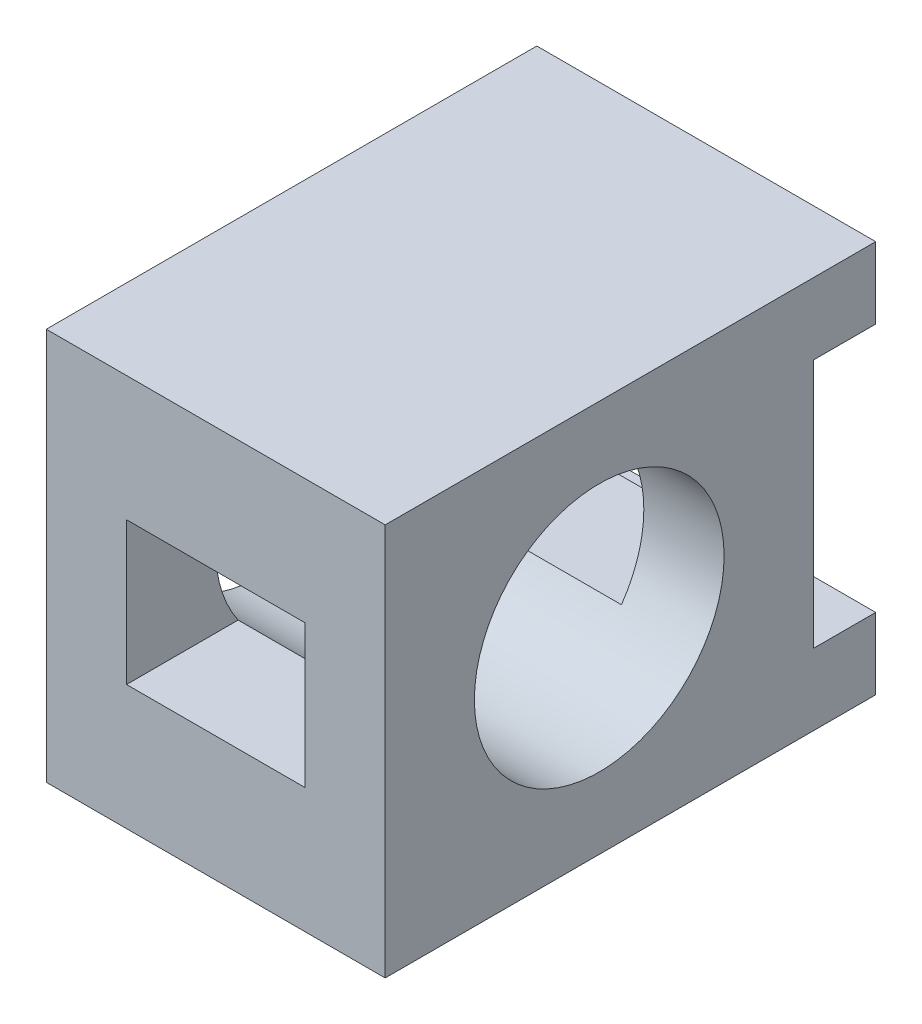
ISO-10303-21;
HEADER;
FILE_DESCRIPTION(('STEP AP214'),'2;1');
FILE_NAME('part.step','',(''),(''),'','','');
FILE_SCHEMA(('AUTOMOTIVE_DESIGN { 1 0 10303 214 1 1 1 1 }'));
ENDSEC;
DATA;
#1=APPLICATION_CONTEXT('core data for automotive mechanical design processes');
#2=APPLICATION_PROTOCOL_DEFINITION('international standard','automotive_design',2000,#1);
#3=PRODUCT_CONTEXT('',#1,'mechanical');
#4=PRODUCT('Part','Part','',(#3));
#5=PRODUCT_RELATED_PRODUCT_CATEGORY('part','',(#4));
#6=PRODUCT_DEFINITION_FORMATION('','',#4);
#7=PRODUCT_DEFINITION_CONTEXT('part definition',#1,'design');
#8=PRODUCT_DEFINITION('design','',#6,#7);
#9=PRODUCT_DEFINITION_SHAPE('','',#8);
#10=(LENGTH_UNIT() NAMED_UNIT(*) SI_UNIT(.MILLI.,.METRE.));
#11=(NAMED_UNIT(*) PLANE_ANGLE_UNIT() SI_UNIT($,.RADIAN.));
#12=(NAMED_UNIT(*) SI_UNIT($,.STERADIAN.) SOLID_ANGLE_UNIT());
#13=UNCERTAINTY_MEASURE_WITH_UNIT(LENGTH_MEASURE(1.E-05),#10,'distance_accuracy_value','');
#14=(GEOMETRIC_REPRESENTATION_CONTEXT(3) GLOBAL_UNCERTAINTY_ASSIGNED_CONTEXT((#13)) GLOBAL_UNIT_ASSIGNED_CONTEXT((#10,
#11,#12)) REPRESENTATION_CONTEXT('',''));
#15=CARTESIAN_POINT('',(0.,0.,0.));
#16=DIRECTION('',(0.,0.,1.));
#17=DIRECTION('',(1.,0.,0.));
#18=AXIS2_PLACEMENT_3D('',#15,#16,#17);
#19=CARTESIAN_POINT('',(0.,0.,-27.5));
#20=DIRECTION('',(0.,0.,-1.));
#21=DIRECTION('',(-1.,0.,0.));
#22=AXIS2_PLACEMENT_3D('',#19,#20,#21);
#23=PLANE('',#22);
#24=DIRECTION('',(1.,0.,0.));
#25=VECTOR('',#24,1.);
#26=CARTESIAN_POINT('',(0.,8.,-27.5));
#27=LINE('',#26,#25);
#28=CARTESIAN_POINT('',(0.,8.,-27.5));
#29=VERTEX_POINT('',#28);
#30=CARTESIAN_POINT('',(38.,8.,-27.5));
#31=VERTEX_POINT('',#30);
#32=EDGE_CURVE('E178',#29,#31,#27,.T.);
#33=ORIENTED_EDGE('',*,*,#32,.T.);
#34=DIRECTION('',(0.,1.,0.));
#35=VECTOR('',#34,1.);
#36=CARTESIAN_POINT('',(38.,0.,-27.5));
#37=LINE('',#36,#35);
#38=CARTESIAN_POINT('',(38.,0.,-27.5));
#39=VERTEX_POINT('',#38);
#40=EDGE_CURVE('E250',#39,#31,#37,.T.);
#41=ORIENTED_EDGE('',*,*,#40,.F.);
#42=DIRECTION('',(1.,0.,0.));
#43=VECTOR('',#42,1.);
#44=CARTESIAN_POINT('',(0.,0.,-27.5));
#45=LINE('',#44,#43);
#46=CARTESIAN_POINT('',(0.,0.,-27.5));
#47=VERTEX_POINT('',#46);
#48=EDGE_CURVE('E247',#47,#39,#45,.T.);
#49=ORIENTED_EDGE('',*,*,#48,.F.);
#50=DIRECTION('',(0.,-1.,0.));
#51=VECTOR('',#50,1.);
#52=CARTESIAN_POINT('',(0.,0.,-27.5));
#53=LINE('',#52,#51);
#54=EDGE_CURVE('E225',#29,#47,#53,.T.);
#55=ORIENTED_EDGE('',*,*,#54,.F.);
#56=EDGE_LOOP('',(#33,#41,#49,#55));
#57=FACE_BOUND('',#56,.T.);
#58=ADVANCED_FACE('F37',(#57),#23,.T.);
#59=CARTESIAN_POINT('',(9.,30.,-27.5));
#60=DIRECTION('',(-1.,0.,0.));
#61=DIRECTION('',(0.,0.,1.));
#62=AXIS2_PLACEMENT_3D('',#59,#60,#61);
#63=PLANE('',#62);
#64=DIRECTION('',(0.,0.,1.));
#65=VECTOR('',#64,1.);
#66=CARTESIAN_POINT('',(9.,14.,-27.5));
#67=LINE('',#66,#65);
#68=CARTESIAN_POINT('',(9.,14.,-20.5));
#69=VERTEX_POINT('',#68);
#70=CARTESIAN_POINT('',(9.00000000000001,14.,-7.98912529307606));
#71=VERTEX_POINT('',#70);
#72=EDGE_CURVE('E233',#69,#71,#67,.T.);
#73=ORIENTED_EDGE('',*,*,#72,.F.);
#74=DIRECTION('',(0.,1.,0.));
#75=VECTOR('',#74,1.);
#76=CARTESIAN_POINT('',(9.,30.,-20.5));
#77=LINE('',#76,#75);
#78=CARTESIAN_POINT('',(9.,30.,-20.5));
#79=VERTEX_POINT('',#78);
#80=EDGE_CURVE('E187',#69,#79,#77,.T.);
#81=ORIENTED_EDGE('',*,*,#80,.T.);
#82=DIRECTION('',(0.,0.,1.));
#83=VECTOR('',#82,1.);
#84=CARTESIAN_POINT('',(9.,30.,-27.5));
#85=LINE('',#84,#83);
#86=CARTESIAN_POINT('',(9.00000000000001,30.,-7.98912529307606));
#87=VERTEX_POINT('',#86);
#88=EDGE_CURVE('E223',#79,#87,#85,.T.);
#89=ORIENTED_EDGE('',*,*,#88,.T.);
#90=CARTESIAN_POINT('',(9.,22.,3.5));
#91=DIRECTION('',(-1.,0.,0.));
#92=DIRECTION('',(0.,0.,1.));
#93=AXIS2_PLACEMENT_3D('',#90,#91,#92);
#94=CIRCLE('',#93,14.);
#95=EDGE_CURVE('E203',#87,#71,#94,.T.);
#96=ORIENTED_EDGE('',*,*,#95,.T.);
#97=EDGE_LOOP('',(#73,#81,#89,#96));
#98=FACE_BOUND('',#97,.T.);
#99=ADVANCED_FACE('F281',(#98),#63,.F.);
#100=CARTESIAN_POINT('',(9.,30.,-27.5));
#101=DIRECTION('',(0.,1.,0.));
#102=DIRECTION('',(-1.,0.,0.));
#103=AXIS2_PLACEMENT_3D('',#100,#101,#102);
#104=PLANE('',#103);
#105=CARTESIAN_POINT('',(9.00000000000001,30.,14.9891252930761));
#106=VERTEX_POINT('',#105);
#107=CARTESIAN_POINT('',(9.,30.,27.5));
#108=VERTEX_POINT('',#107);
#109=EDGE_CURVE('E226',#106,#108,#85,.T.);
#110=ORIENTED_EDGE('',*,*,#109,.F.);
#111=DIRECTION('',(1.,0.,0.));
#112=VECTOR('',#111,1.);
#113=CARTESIAN_POINT('',(-17.,30.,14.9891252930761));
#114=LINE('',#113,#112);
#115=CARTESIAN_POINT('',(29.,30.,14.9891252930761));
#116=VERTEX_POINT('',#115);
#117=EDGE_CURVE('E196',#106,#116,#114,.T.);
#118=ORIENTED_EDGE('',*,*,#117,.T.);
#119=DIRECTION('',(0.,0.,1.));
#120=VECTOR('',#119,1.);
#121=CARTESIAN_POINT('',(29.,30.,-27.5));
#122=LINE('',#121,#120);
#123=CARTESIAN_POINT('',(29.,30.,27.5));
#124=VERTEX_POINT('',#123);
#125=EDGE_CURVE('E229',#116,#124,#122,.T.);
#126=ORIENTED_EDGE('',*,*,#125,.T.);
#127=DIRECTION('',(-1.,0.,0.));
#128=VECTOR('',#127,1.);
#129=CARTESIAN_POINT('',(9.,30.,27.5));
#130=LINE('',#129,#128);
#131=EDGE_CURVE('E219',#124,#108,#130,.T.);
#132=ORIENTED_EDGE('',*,*,#131,.T.);
#133=EDGE_LOOP('',(#110,#118,#126,#132));
#134=FACE_BOUND('',#133,.T.);
#135=ADVANCED_FACE('F307',(#134),#104,.F.);
#136=CARTESIAN_POINT('',(29.,30.,-27.5));
#137=DIRECTION('',(1.,0.,0.));
#138=DIRECTION('',(0.,1.,0.));
#139=AXIS2_PLACEMENT_3D('',#136,#137,#138);
#140=PLANE('',#139);
#141=ORIENTED_EDGE('',*,*,#125,.F.);
#142=CARTESIAN_POINT('',(29.,22.,3.5));
#143=DIRECTION('',(1.,0.,0.));
#144=DIRECTION('',(0.,1.,0.));
#145=AXIS2_PLACEMENT_3D('',#142,#143,#144);
#146=CIRCLE('',#145,14.);
#147=CARTESIAN_POINT('',(29.,14.,14.9891252930761));
#148=VERTEX_POINT('',#147);
#149=EDGE_CURVE('E193',#116,#148,#146,.T.);
#150=ORIENTED_EDGE('',*,*,#149,.T.);
#151=DIRECTION('',(0.,0.,1.));
#152=VECTOR('',#151,1.);
#153=CARTESIAN_POINT('',(29.,14.,-27.5));
#154=LINE('',#153,#152);
#155=CARTESIAN_POINT('',(29.,14.,27.5));
#156=VERTEX_POINT('',#155);
#157=EDGE_CURVE('E232',#148,#156,#154,.T.);
#158=ORIENTED_EDGE('',*,*,#157,.T.);
#159=DIRECTION('',(0.,1.,0.));
#160=VECTOR('',#159,1.);
#161=CARTESIAN_POINT('',(29.,30.,27.5));
#162=LINE('',#161,#160);
#163=EDGE_CURVE('E216',#156,#124,#162,.T.);
#164=ORIENTED_EDGE('',*,*,#163,.T.);
#165=EDGE_LOOP('',(#141,#150,#158,#164));
#166=FACE_BOUND('',#165,.T.);
#167=ADVANCED_FACE('F355',(#166),#140,.F.);
#168=CARTESIAN_POINT('',(9.,14.,-27.5));
#169=DIRECTION('',(0.,-1.,0.));
#170=DIRECTION('',(1.,0.,0.));
#171=AXIS2_PLACEMENT_3D('',#168,#169,#170);
#172=PLANE('',#171);
#173=CARTESIAN_POINT('',(29.,14.,-20.5));
#174=VERTEX_POINT('',#173);
#175=CARTESIAN_POINT('',(29.,14.,-7.98912529307606));
#176=VERTEX_POINT('',#175);
#177=EDGE_CURVE('E230',#174,#176,#154,.T.);
#178=ORIENTED_EDGE('',*,*,#177,.F.);
#179=DIRECTION('',(-1.,0.,0.));
#180=VECTOR('',#179,1.);
#181=CARTESIAN_POINT('',(9.,14.,-20.5));
#182=LINE('',#181,#180);
#183=EDGE_CURVE('E60',#174,#69,#182,.T.);
#184=ORIENTED_EDGE('',*,*,#183,.T.);
#185=ORIENTED_EDGE('',*,*,#72,.T.);
#186=DIRECTION('',(1.,0.,0.));
#187=VECTOR('',#186,1.);
#188=CARTESIAN_POINT('',(-17.,14.,-7.98912529307606));
#189=LINE('',#188,#187);
#190=EDGE_CURVE('E45',#71,#176,#189,.T.);
#191=ORIENTED_EDGE('',*,*,#190,.T.);
#192=EDGE_LOOP('',(#178,#184,#185,#191));
#193=FACE_BOUND('',#192,.T.);
#194=ADVANCED_FACE('F270',(#193),#172,.F.);
#195=CARTESIAN_POINT('',(0.,0.,27.5));
#196=DIRECTION('',(1.,0.,0.));
#197=DIRECTION('',(0.,0.,-1.));
#198=AXIS2_PLACEMENT_3D('',#195,#196,#197);
#199=PLANE('',#198);
#200=CARTESIAN_POINT('',(0.,22.,3.5));
#201=DIRECTION('',(1.,0.,0.));
#202=DIRECTION('',(0.,0.,-1.));
#203=AXIS2_PLACEMENT_3D('',#200,#201,#202);
#204=CIRCLE('',#203,14.);
#205=CARTESIAN_POINT('',(0.,22.,-10.5));
#206=VERTEX_POINT('',#205);
#207=EDGE_CURVE('E207',#206,#206,#204,.T.);
#208=ORIENTED_EDGE('',*,*,#207,.T.);
#209=EDGE_LOOP('',(#208));
#210=FACE_BOUND('',#209,.T.);
#211=DIRECTION('',(0.,-1.,0.));
#212=VECTOR('',#211,1.);
#213=CARTESIAN_POINT('',(0.,36.,-20.5));
#214=LINE('',#213,#212);
#215=CARTESIAN_POINT('',(0.,36.,-20.5));
#216=VERTEX_POINT('',#215);
#217=CARTESIAN_POINT('',(0.,8.,-20.5));
#218=VERTEX_POINT('',#217);
#219=EDGE_CURVE('E159',#216,#218,#214,.T.);
#220=ORIENTED_EDGE('',*,*,#219,.T.);
#221=DIRECTION('',(0.,0.,-1.));
#222=VECTOR('',#221,1.);
#223=CARTESIAN_POINT('',(0.,8.,-20.5));
#224=LINE('',#223,#222);
#225=EDGE_CURVE('E164',#218,#29,#224,.T.);
#226=ORIENTED_EDGE('',*,*,#225,.T.);
#227=ORIENTED_EDGE('',*,*,#54,.T.);
#228=DIRECTION('',(0.,0.,-1.));
#229=VECTOR('',#228,1.);
#230=CARTESIAN_POINT('',(0.,0.,27.5));
#231=LINE('',#230,#229);
#232=CARTESIAN_POINT('',(0.,0.,27.5));
#233=VERTEX_POINT('',#232);
#234=EDGE_CURVE('E261',#233,#47,#231,.T.);
#235=ORIENTED_EDGE('',*,*,#234,.F.);
#236=DIRECTION('',(0.,-1.,0.));
#237=VECTOR('',#236,1.);
#238=CARTESIAN_POINT('',(0.,0.,27.5));
#239=LINE('',#238,#237);
#240=CARTESIAN_POINT('',(0.,44.,27.5));
#241=VERTEX_POINT('',#240);
#242=EDGE_CURVE('E235',#241,#233,#239,.T.);
#243=ORIENTED_EDGE('',*,*,#242,.F.);
#244=DIRECTION('',(0.,0.,-1.));
#245=VECTOR('',#244,1.);
#246=CARTESIAN_POINT('',(0.,44.,27.5));
#247=LINE('',#246,#245);
#248=CARTESIAN_POINT('',(0.,44.,-27.5));
#249=VERTEX_POINT('',#248);
#250=EDGE_CURVE('E245',#241,#249,#247,.T.);
#251=ORIENTED_EDGE('',*,*,#250,.T.);
#252=CARTESIAN_POINT('',(0.,36.,-27.5));
#253=VERTEX_POINT('',#252);
#254=EDGE_CURVE('E169',#249,#253,#53,.T.);
#255=ORIENTED_EDGE('',*,*,#254,.T.);
#256=DIRECTION('',(0.,0.,1.));
#257=VECTOR('',#256,1.);
#258=CARTESIAN_POINT('',(0.,36.,-27.5));
#259=LINE('',#258,#257);
#260=EDGE_CURVE('E52',#253,#216,#259,.T.);
#261=ORIENTED_EDGE('',*,*,#260,.T.);
#262=EDGE_LOOP('',(#220,#226,#227,#235,#243,#251,#255,#261));
#263=FACE_BOUND('',#262,.T.);
#264=ADVANCED_FACE('F39',(#210,#263),#199,.F.);
#265=CARTESIAN_POINT('',(0.,0.,27.5));
#266=DIRECTION('',(0.,1.,0.));
#267=DIRECTION('',(0.,0.,1.));
#268=AXIS2_PLACEMENT_3D('',#265,#266,#267);
#269=PLANE('',#268);
#270=ORIENTED_EDGE('',*,*,#48,.T.);
#271=DIRECTION('',(0.,0.,-1.));
#272=VECTOR('',#271,1.);
#273=CARTESIAN_POINT('',(38.,0.,27.5));
#274=LINE('',#273,#272);
#275=CARTESIAN_POINT('',(38.,0.,27.5));
#276=VERTEX_POINT('',#275);
#277=EDGE_CURVE('E258',#276,#39,#274,.T.);
#278=ORIENTED_EDGE('',*,*,#277,.F.);
#279=DIRECTION('',(1.,0.,0.));
#280=VECTOR('',#279,1.);
#281=CARTESIAN_POINT('',(0.,0.,27.5));
#282=LINE('',#281,#280);
#283=EDGE_CURVE('E238',#233,#276,#282,.T.);
#284=ORIENTED_EDGE('',*,*,#283,.F.);
#285=ORIENTED_EDGE('',*,*,#234,.T.);
#286=EDGE_LOOP('',(#270,#278,#284,#285));
#287=FACE_BOUND('',#286,.T.);
#288=ADVANCED_FACE('F334',(#287),#269,.F.);
#289=CARTESIAN_POINT('',(38.,0.,27.5));
#290=DIRECTION('',(-1.,0.,0.));
#291=DIRECTION('',(0.,0.,1.));
#292=AXIS2_PLACEMENT_3D('',#289,#290,#291);
#293=PLANE('',#292);
#294=CARTESIAN_POINT('',(38.,22.,3.5));
#295=DIRECTION('',(1.,0.,0.));
#296=DIRECTION('',(0.,0.,-1.));
#297=AXIS2_PLACEMENT_3D('',#294,#295,#296);
#298=CIRCLE('',#297,14.);
#299=CARTESIAN_POINT('',(38.,22.,-10.5));
#300=VERTEX_POINT('',#299);
#301=EDGE_CURVE('E190',#300,#300,#298,.T.);
#302=ORIENTED_EDGE('',*,*,#301,.F.);
#303=EDGE_LOOP('',(#302));
#304=FACE_BOUND('',#303,.T.);
#305=ORIENTED_EDGE('',*,*,#40,.T.);
#306=DIRECTION('',(0.,0.,-1.));
#307=VECTOR('',#306,1.);
#308=CARTESIAN_POINT('',(38.,8.,-20.5));
#309=LINE('',#308,#307);
#310=CARTESIAN_POINT('',(38.,8.,-20.5));
#311=VERTEX_POINT('',#310);
#312=EDGE_CURVE('E170',#311,#31,#309,.T.);
#313=ORIENTED_EDGE('',*,*,#312,.F.);
#314=DIRECTION('',(0.,-1.,0.));
#315=VECTOR('',#314,1.);
#316=CARTESIAN_POINT('',(38.,36.,-20.5));
#317=LINE('',#316,#315);
#318=CARTESIAN_POINT('',(38.,36.,-20.5));
#319=VERTEX_POINT('',#318);
#320=EDGE_CURVE('E172',#319,#311,#317,.T.);
#321=ORIENTED_EDGE('',*,*,#320,.F.);
#322=DIRECTION('',(0.,0.,1.));
#323=VECTOR('',#322,1.);
#324=CARTESIAN_POINT('',(38.,36.,-27.5));
#325=LINE('',#324,#323);
#326=CARTESIAN_POINT('',(38.,36.,-27.5));
#327=VERTEX_POINT('',#326);
#328=EDGE_CURVE('E151',#327,#319,#325,.T.);
#329=ORIENTED_EDGE('',*,*,#328,.F.);
#330=CARTESIAN_POINT('',(38.,44.,-27.5));
#331=VERTEX_POINT('',#330);
#332=EDGE_CURVE('E249',#327,#331,#37,.T.);
#333=ORIENTED_EDGE('',*,*,#332,.T.);
#334=DIRECTION('',(0.,0.,-1.));
#335=VECTOR('',#334,1.);
#336=CARTESIAN_POINT('',(38.,44.,27.5));
#337=LINE('',#336,#335);
#338=CARTESIAN_POINT('',(38.,44.,27.5));
#339=VERTEX_POINT('',#338);
#340=EDGE_CURVE('E255',#339,#331,#337,.T.);
#341=ORIENTED_EDGE('',*,*,#340,.F.);
#342=DIRECTION('',(0.,1.,0.));
#343=VECTOR('',#342,1.);
#344=CARTESIAN_POINT('',(38.,0.,27.5));
#345=LINE('',#344,#343);
#346=EDGE_CURVE('E241',#276,#339,#345,.T.);
#347=ORIENTED_EDGE('',*,*,#346,.F.);
#348=ORIENTED_EDGE('',*,*,#277,.T.);
#349=EDGE_LOOP('',(#305,#313,#321,#329,#333,#341,#347,#348));
#350=FACE_BOUND('',#349,.T.);
#351=ADVANCED_FACE('F325',(#304,#350),#293,.F.);
#352=CARTESIAN_POINT('',(0.,44.,27.5));
#353=DIRECTION('',(0.,-1.,0.));
#354=DIRECTION('',(0.,0.,-1.));
#355=AXIS2_PLACEMENT_3D('',#352,#353,#354);
#356=PLANE('',#355);
#357=DIRECTION('',(-1.,0.,0.));
#358=VECTOR('',#357,1.);
#359=CARTESIAN_POINT('',(0.,44.,-27.5));
#360=LINE('',#359,#358);
#361=EDGE_CURVE('E239',#331,#249,#360,.T.);
#362=ORIENTED_EDGE('',*,*,#361,.T.);
#363=ORIENTED_EDGE('',*,*,#250,.F.);
#364=DIRECTION('',(-1.,0.,0.));
#365=VECTOR('',#364,1.);
#366=CARTESIAN_POINT('',(0.,44.,27.5));
#367=LINE('',#366,#365);
#368=EDGE_CURVE('E243',#339,#241,#367,.T.);
#369=ORIENTED_EDGE('',*,*,#368,.F.);
#370=ORIENTED_EDGE('',*,*,#340,.T.);
#371=EDGE_LOOP('',(#362,#363,#369,#370));
#372=FACE_BOUND('',#371,.T.);
#373=ADVANCED_FACE('F320',(#372),#356,.F.);
#374=CARTESIAN_POINT('',(0.,0.,27.5));
#375=DIRECTION('',(0.,0.,-1.));
#376=DIRECTION('',(-1.,0.,0.));
#377=AXIS2_PLACEMENT_3D('',#374,#375,#376);
#378=PLANE('',#377);
#379=DIRECTION('',(1.,0.,0.));
#380=VECTOR('',#379,1.);
#381=CARTESIAN_POINT('',(9.,14.,27.5));
#382=LINE('',#381,#380);
#383=CARTESIAN_POINT('',(9.,14.,27.5));
#384=VERTEX_POINT('',#383);
#385=EDGE_CURVE('E213',#384,#156,#382,.T.);
#386=ORIENTED_EDGE('',*,*,#385,.F.);
#387=DIRECTION('',(0.,-1.,0.));
#388=VECTOR('',#387,1.);
#389=CARTESIAN_POINT('',(9.,30.,27.5));
#390=LINE('',#389,#388);
#391=EDGE_CURVE('E210',#108,#384,#390,.T.);
#392=ORIENTED_EDGE('',*,*,#391,.F.);
#393=ORIENTED_EDGE('',*,*,#131,.F.);
#394=ORIENTED_EDGE('',*,*,#163,.F.);
#395=EDGE_LOOP('',(#386,#392,#393,#394));
#396=FACE_BOUND('',#395,.T.);
#397=ORIENTED_EDGE('',*,*,#242,.T.);
#398=ORIENTED_EDGE('',*,*,#283,.T.);
#399=ORIENTED_EDGE('',*,*,#346,.T.);
#400=ORIENTED_EDGE('',*,*,#368,.T.);
#401=EDGE_LOOP('',(#397,#398,#399,#400));
#402=FACE_BOUND('',#401,.T.);
#403=ADVANCED_FACE('F313',(#396,#402),#378,.F.);
#404=DIRECTION('',(1.,0.,0.));
#405=VECTOR('',#404,1.);
#406=CARTESIAN_POINT('',(0.,36.,-27.5));
#407=LINE('',#406,#405);
#408=EDGE_CURVE('E156',#253,#327,#407,.T.);
#409=ORIENTED_EDGE('',*,*,#408,.F.);
#410=ORIENTED_EDGE('',*,*,#254,.F.);
#411=ORIENTED_EDGE('',*,*,#361,.F.);
#412=ORIENTED_EDGE('',*,*,#332,.F.);
#413=EDGE_LOOP('',(#409,#410,#411,#412));
#414=FACE_BOUND('',#413,.T.);
#415=ADVANCED_FACE('F303',(#414),#23,.T.);
#416=CARTESIAN_POINT('',(9.,14.,14.9891252930761));
#417=VERTEX_POINT('',#416);
#418=EDGE_CURVE('E222',#417,#384,#67,.T.);
#419=ORIENTED_EDGE('',*,*,#418,.F.);
#420=EDGE_CURVE('E200',#417,#106,#94,.T.);
#421=ORIENTED_EDGE('',*,*,#420,.T.);
#422=ORIENTED_EDGE('',*,*,#109,.T.);
#423=ORIENTED_EDGE('',*,*,#391,.T.);
#424=EDGE_LOOP('',(#419,#421,#422,#423));
#425=FACE_BOUND('',#424,.T.);
#426=ADVANCED_FACE('F309',(#425),#63,.F.);
#427=ORIENTED_EDGE('',*,*,#88,.F.);
#428=DIRECTION('',(1.,0.,0.));
#429=VECTOR('',#428,1.);
#430=CARTESIAN_POINT('',(9.,30.,-20.5));
#431=LINE('',#430,#429);
#432=CARTESIAN_POINT('',(29.,30.,-20.5));
#433=VERTEX_POINT('',#432);
#434=EDGE_CURVE('E181',#79,#433,#431,.T.);
#435=ORIENTED_EDGE('',*,*,#434,.T.);
#436=CARTESIAN_POINT('',(29.,30.,-7.98912529307606));
#437=VERTEX_POINT('',#436);
#438=EDGE_CURVE('E227',#433,#437,#122,.T.);
#439=ORIENTED_EDGE('',*,*,#438,.T.);
#440=DIRECTION('',(1.,0.,0.));
#441=VECTOR('',#440,1.);
#442=CARTESIAN_POINT('',(-17.,30.,-7.98912529307606));
#443=LINE('',#442,#441);
#444=EDGE_CURVE('E204',#437,#87,#443,.F.);
#445=ORIENTED_EDGE('',*,*,#444,.T.);
#446=EDGE_LOOP('',(#427,#435,#439,#445));
#447=FACE_BOUND('',#446,.T.);
#448=ADVANCED_FACE('F284',(#447),#104,.F.);
#449=ORIENTED_EDGE('',*,*,#438,.F.);
#450=DIRECTION('',(0.,-1.,0.));
#451=VECTOR('',#450,1.);
#452=CARTESIAN_POINT('',(29.,30.,-20.5));
#453=LINE('',#452,#451);
#454=EDGE_CURVE('E11',#433,#174,#453,.T.);
#455=ORIENTED_EDGE('',*,*,#454,.T.);
#456=ORIENTED_EDGE('',*,*,#177,.T.);
#457=EDGE_CURVE('E197',#176,#437,#146,.T.);
#458=ORIENTED_EDGE('',*,*,#457,.T.);
#459=EDGE_LOOP('',(#449,#455,#456,#458));
#460=FACE_BOUND('',#459,.T.);
#461=ADVANCED_FACE('F287',(#460),#140,.F.);
#462=ORIENTED_EDGE('',*,*,#157,.F.);
#463=DIRECTION('',(1.,0.,0.));
#464=VECTOR('',#463,1.);
#465=CARTESIAN_POINT('',(-17.,14.,14.9891252930761));
#466=LINE('',#465,#464);
#467=EDGE_CURVE('E264',#148,#417,#466,.F.);
#468=ORIENTED_EDGE('',*,*,#467,.T.);
#469=ORIENTED_EDGE('',*,*,#418,.T.);
#470=ORIENTED_EDGE('',*,*,#385,.T.);
#471=EDGE_LOOP('',(#462,#468,#469,#470));
#472=FACE_BOUND('',#471,.T.);
#473=ADVANCED_FACE('F297',(#472),#172,.F.);
#474=CARTESIAN_POINT('',(-17.,22.,3.5));
#475=DIRECTION('',(1.,0.,0.));
#476=DIRECTION('',(0.,0.,-1.));
#477=AXIS2_PLACEMENT_3D('',#474,#475,#476);
#478=CYLINDRICAL_SURFACE('',#477,14.);
#479=ORIENTED_EDGE('',*,*,#444,.F.);
#480=ORIENTED_EDGE('',*,*,#457,.F.);
#481=ORIENTED_EDGE('',*,*,#190,.F.);
#482=ORIENTED_EDGE('',*,*,#95,.F.);
#483=EDGE_LOOP('',(#479,#480,#481,#482));
#484=FACE_BOUND('',#483,.T.);
#485=ORIENTED_EDGE('',*,*,#467,.F.);
#486=ORIENTED_EDGE('',*,*,#149,.F.);
#487=ORIENTED_EDGE('',*,*,#117,.F.);
#488=ORIENTED_EDGE('',*,*,#420,.F.);
#489=EDGE_LOOP('',(#485,#486,#487,#488));
#490=FACE_BOUND('',#489,.T.);
#491=ORIENTED_EDGE('',*,*,#301,.T.);
#492=EDGE_LOOP('',(#491));
#493=FACE_BOUND('',#492,.T.);
#494=ORIENTED_EDGE('',*,*,#207,.F.);
#495=EDGE_LOOP('',(#494));
#496=FACE_BOUND('',#495,.T.);
#497=ADVANCED_FACE('F277',(#484,#490,#493,#496),#478,.F.);
#498=CARTESIAN_POINT('',(0.,36.,-20.5));
#499=DIRECTION('',(0.,0.,1.));
#500=DIRECTION('',(1.,0.,0.));
#501=AXIS2_PLACEMENT_3D('',#498,#499,#500);
#502=PLANE('',#501);
#503=ORIENTED_EDGE('',*,*,#320,.T.);
#504=DIRECTION('',(1.,0.,0.));
#505=VECTOR('',#504,1.);
#506=CARTESIAN_POINT('',(0.,8.,-20.5));
#507=LINE('',#506,#505);
#508=EDGE_CURVE('E155',#218,#311,#507,.T.);
#509=ORIENTED_EDGE('',*,*,#508,.F.);
#510=ORIENTED_EDGE('',*,*,#219,.F.);
#511=DIRECTION('',(1.,0.,0.));
#512=VECTOR('',#511,1.);
#513=CARTESIAN_POINT('',(0.,36.,-20.5));
#514=LINE('',#513,#512);
#515=EDGE_CURVE('E147',#216,#319,#514,.T.);
#516=ORIENTED_EDGE('',*,*,#515,.T.);
#517=EDGE_LOOP('',(#503,#509,#510,#516));
#518=FACE_BOUND('',#517,.T.);
#519=ORIENTED_EDGE('',*,*,#183,.F.);
#520=ORIENTED_EDGE('',*,*,#454,.F.);
#521=ORIENTED_EDGE('',*,*,#434,.F.);
#522=ORIENTED_EDGE('',*,*,#80,.F.);
#523=EDGE_LOOP('',(#519,#520,#521,#522));
#524=FACE_BOUND('',#523,.T.);
#525=ADVANCED_FACE('F160',(#518,#524),#502,.F.);
#526=CARTESIAN_POINT('',(0.,8.,-20.5));
#527=DIRECTION('',(0.,-1.,0.));
#528=DIRECTION('',(0.,0.,-1.));
#529=AXIS2_PLACEMENT_3D('',#526,#527,#528);
#530=PLANE('',#529);
#531=ORIENTED_EDGE('',*,*,#312,.T.);
#532=ORIENTED_EDGE('',*,*,#32,.F.);
#533=ORIENTED_EDGE('',*,*,#225,.F.);
#534=ORIENTED_EDGE('',*,*,#508,.T.);
#535=EDGE_LOOP('',(#531,#532,#533,#534));
#536=FACE_BOUND('',#535,.T.);
#537=ADVANCED_FACE('F289',(#536),#530,.F.);
#538=CARTESIAN_POINT('',(0.,36.,-27.5));
#539=DIRECTION('',(0.,1.,0.));
#540=DIRECTION('',(0.,0.,1.));
#541=AXIS2_PLACEMENT_3D('',#538,#539,#540);
#542=PLANE('',#541);
#543=ORIENTED_EDGE('',*,*,#328,.T.);
#544=ORIENTED_EDGE('',*,*,#515,.F.);
#545=ORIENTED_EDGE('',*,*,#260,.F.);
#546=ORIENTED_EDGE('',*,*,#408,.T.);
#547=EDGE_LOOP('',(#543,#544,#545,#546));
#548=FACE_BOUND('',#547,.T.);
#549=ADVANCED_FACE('F149',(#548),#542,.F.);
#550=CLOSED_SHELL('',(#58,#99,#135,#167,#194,#264,#288,#351,#373,#403,#415,#426,#448,#461,#473,
#497,#525,#537,#549));
#551=MANIFOLD_SOLID_BREP('B2',#550);
#552=ADVANCED_BREP_SHAPE_REPRESENTATION('',(#18,#551),#14);
#553=SHAPE_DEFINITION_REPRESENTATION(#9,#552);
ENDSEC;
END-ISO-10303-21;
